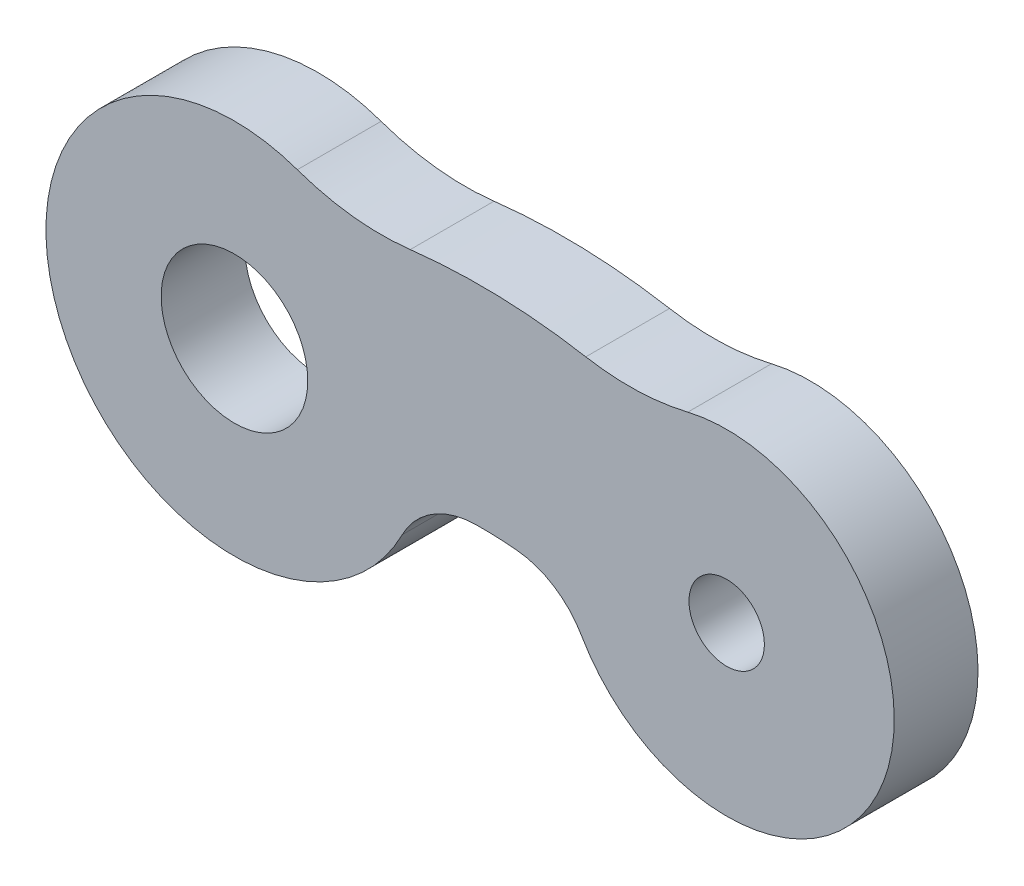
ISO-10303-21;
HEADER;
FILE_DESCRIPTION(('STEP AP214'),'2;1');
FILE_NAME('part.step','',(''),(''),'','','');
FILE_SCHEMA(('AUTOMOTIVE_DESIGN { 1 0 10303 214 1 1 1 1 }'));
ENDSEC;
DATA;
#1=APPLICATION_CONTEXT('core data for automotive mechanical design processes');
#2=APPLICATION_PROTOCOL_DEFINITION('international standard','automotive_design',2000,#1);
#3=PRODUCT_CONTEXT('',#1,'mechanical');
#4=PRODUCT('Part','Part','',(#3));
#5=PRODUCT_RELATED_PRODUCT_CATEGORY('part','',(#4));
#6=PRODUCT_DEFINITION_FORMATION('','',#4);
#7=PRODUCT_DEFINITION_CONTEXT('part definition',#1,'design');
#8=PRODUCT_DEFINITION('design','',#6,#7);
#9=PRODUCT_DEFINITION_SHAPE('','',#8);
#10=(LENGTH_UNIT() NAMED_UNIT(*) SI_UNIT(.MILLI.,.METRE.));
#11=(NAMED_UNIT(*) PLANE_ANGLE_UNIT() SI_UNIT($,.RADIAN.));
#12=(NAMED_UNIT(*) SI_UNIT($,.STERADIAN.) SOLID_ANGLE_UNIT());
#13=UNCERTAINTY_MEASURE_WITH_UNIT(LENGTH_MEASURE(1.E-05),#10,'distance_accuracy_value','');
#14=(GEOMETRIC_REPRESENTATION_CONTEXT(3) GLOBAL_UNCERTAINTY_ASSIGNED_CONTEXT((#13)) GLOBAL_UNIT_ASSIGNED_CONTEXT((#10,
#11,#12)) REPRESENTATION_CONTEXT('',''));
#15=CARTESIAN_POINT('',(0.,0.,0.));
#16=DIRECTION('',(0.,0.,1.));
#17=DIRECTION('',(1.,0.,0.));
#18=AXIS2_PLACEMENT_3D('',#15,#16,#17);
#19=CARTESIAN_POINT('',(10.5885127332144,4.86322396452138,2.));
#20=DIRECTION('',(0.,0.,1.));
#21=DIRECTION('',(1.,0.,0.));
#22=AXIS2_PLACEMENT_3D('',#19,#20,#21);
#23=PLANE('',#22);
#24=CARTESIAN_POINT('',(0.,0.,2.));
#25=DIRECTION('',(0.,0.,1.));
#26=DIRECTION('',(1.,0.,0.));
#27=AXIS2_PLACEMENT_3D('',#24,#25,#26);
#28=CIRCLE('',#27,1.75);
#29=CARTESIAN_POINT('',(1.75,0.,2.));
#30=VERTEX_POINT('',#29);
#31=EDGE_CURVE('E135',#30,#30,#28,.T.);
#32=ORIENTED_EDGE('',*,*,#31,.F.);
#33=EDGE_LOOP('',(#32));
#34=FACE_BOUND('',#33,.T.);
#35=CARTESIAN_POINT('',(9.42702546642888,9.72644792904275,2.));
#36=DIRECTION('',(0.,0.,-1.));
#37=DIRECTION('',(1.,0.,0.));
#38=AXIS2_PLACEMENT_3D('',#35,#36,#37);
#39=CIRCLE('',#38,6.);
#40=CARTESIAN_POINT('',(10.8208101865716,3.8905791716171,2.));
#41=VERTEX_POINT('',#40);
#42=CARTESIAN_POINT('',(8.38740825674238,3.81720127169939,2.));
#43=VERTEX_POINT('',#42);
#44=EDGE_CURVE('E146',#41,#43,#39,.T.);
#45=ORIENTED_EDGE('',*,*,#44,.T.);
#46=CARTESIAN_POINT('',(5.875,-10.4634781502137,2.));
#47=DIRECTION('',(0.,0.,1.));
#48=DIRECTION('',(-1.,0.,0.));
#49=AXIS2_PLACEMENT_3D('',#46,#47,#48);
#50=CIRCLE('',#49,14.5);
#51=CARTESIAN_POINT('',(4.19664720756028,3.93906092816096,2.));
#52=VERTEX_POINT('',#51);
#53=EDGE_CURVE('E94',#43,#52,#50,.T.);
#54=ORIENTED_EDGE('',*,*,#53,.T.);
#55=CARTESIAN_POINT('',(3.50215639689558,9.89873227093669,2.));
#56=DIRECTION('',(0.,0.,-1.));
#57=DIRECTION('',(-1.,0.,0.));
#58=AXIS2_PLACEMENT_3D('',#55,#56,#57);
#59=CIRCLE('',#58,6.);
#60=CARTESIAN_POINT('',(1.50092417009811,4.24231383040144,2.));
#61=VERTEX_POINT('',#60);
#62=EDGE_CURVE('E161',#52,#61,#59,.T.);
#63=ORIENTED_EDGE('',*,*,#62,.T.);
#64=CARTESIAN_POINT('',(0.,0.,2.));
#65=DIRECTION('',(0.,0.,1.));
#66=DIRECTION('',(1.,0.,0.));
#67=AXIS2_PLACEMENT_3D('',#64,#65,#66);
#68=CIRCLE('',#67,4.5);
#69=CARTESIAN_POINT('',(4.0049019391463,-2.05201375673317,2.));
#70=VERTEX_POINT('',#69);
#71=EDGE_CURVE('E174',#61,#70,#68,.T.);
#72=ORIENTED_EDGE('',*,*,#71,.T.);
#73=CARTESIAN_POINT('',(5.78485835654466,-2.9640198708368,2.));
#74=DIRECTION('',(0.,0.,-1.));
#75=DIRECTION('',(1.,0.,0.));
#76=AXIS2_PLACEMENT_3D('',#73,#74,#75);
#77=CIRCLE('',#76,2.);
#78=CARTESIAN_POINT('',(5.76082058495658,-0.964164329669615,2.));
#79=VERTEX_POINT('',#78);
#80=EDGE_CURVE('E113',#70,#79,#77,.T.);
#81=ORIENTED_EDGE('',*,*,#80,.T.);
#82=CARTESIAN_POINT('',(5.875,-10.4634781502137,2.));
#83=DIRECTION('',(0.,0.,-1.));
#84=DIRECTION('',(-1.,0.,0.));
#85=AXIS2_PLACEMENT_3D('',#82,#83,#84);
#86=CIRCLE('',#85,9.49999999999999);
#87=CARTESIAN_POINT('',(6.73045310472273,-1.00207233576838,2.));
#88=VERTEX_POINT('',#87);
#89=EDGE_CURVE('E107',#79,#88,#86,.T.);
#90=ORIENTED_EDGE('',*,*,#89,.T.);
#91=CARTESIAN_POINT('',(6.55035771425478,-2.99394724407266,2.));
#92=DIRECTION('',(0.,0.,-1.));
#93=DIRECTION('',(-1.,0.,0.));
#94=AXIS2_PLACEMENT_3D('',#91,#92,#93);
#95=CIRCLE('',#94,2.);
#96=CARTESIAN_POINT('',(8.28357180950319,-1.99596482938177,2.));
#97=VERTEX_POINT('',#96);
#98=EDGE_CURVE('E111',#88,#97,#95,.T.);
#99=ORIENTED_EDGE('',*,*,#98,.T.);
#100=CARTESIAN_POINT('',(11.75,0.,2.));
#101=DIRECTION('',(0.,0.,1.));
#102=DIRECTION('',(1.,0.,0.));
#103=AXIS2_PLACEMENT_3D('',#100,#101,#102);
#104=CIRCLE('',#103,4.);
#105=EDGE_CURVE('E51',#97,#41,#104,.T.);
#106=ORIENTED_EDGE('',*,*,#105,.T.);
#107=EDGE_LOOP('',(#45,#54,#63,#72,#81,#90,#99,#106));
#108=FACE_BOUND('',#107,.T.);
#109=CARTESIAN_POINT('',(11.75,0.,2.));
#110=DIRECTION('',(0.,0.,1.));
#111=DIRECTION('',(1.,0.,0.));
#112=AXIS2_PLACEMENT_3D('',#109,#110,#111);
#113=CIRCLE('',#112,0.9);
#114=CARTESIAN_POINT('',(12.65,0.,2.));
#115=VERTEX_POINT('',#114);
#116=EDGE_CURVE('E183',#115,#115,#113,.T.);
#117=ORIENTED_EDGE('',*,*,#116,.F.);
#118=EDGE_LOOP('',(#117));
#119=FACE_BOUND('',#118,.T.);
#120=ADVANCED_FACE('F34',(#34,#108,#119),#23,.T.);
#121=CARTESIAN_POINT('',(10.5885127332144,4.86322396452138,0.));
#122=DIRECTION('',(0.,0.,1.));
#123=DIRECTION('',(1.,0.,0.));
#124=AXIS2_PLACEMENT_3D('',#121,#122,#123);
#125=PLANE('',#124);
#126=CARTESIAN_POINT('',(9.42702546642888,9.72644792904275,0.));
#127=DIRECTION('',(0.,0.,-1.));
#128=DIRECTION('',(1.,0.,0.));
#129=AXIS2_PLACEMENT_3D('',#126,#127,#128);
#130=CIRCLE('',#129,6.);
#131=CARTESIAN_POINT('',(10.8208101865716,3.8905791716171,0.));
#132=VERTEX_POINT('',#131);
#133=CARTESIAN_POINT('',(8.38740825674238,3.81720127169939,0.));
#134=VERTEX_POINT('',#133);
#135=EDGE_CURVE('E131',#132,#134,#130,.T.);
#136=ORIENTED_EDGE('',*,*,#135,.F.);
#137=CARTESIAN_POINT('',(11.75,0.,0.));
#138=DIRECTION('',(0.,0.,1.));
#139=DIRECTION('',(1.,0.,0.));
#140=AXIS2_PLACEMENT_3D('',#137,#138,#139);
#141=CIRCLE('',#140,4.);
#142=CARTESIAN_POINT('',(8.28357180950319,-1.99596482938177,0.));
#143=VERTEX_POINT('',#142);
#144=EDGE_CURVE('E86',#143,#132,#141,.T.);
#145=ORIENTED_EDGE('',*,*,#144,.F.);
#146=CARTESIAN_POINT('',(6.55035771425478,-2.99394724407266,0.));
#147=DIRECTION('',(0.,0.,-1.));
#148=DIRECTION('',(-1.,0.,0.));
#149=AXIS2_PLACEMENT_3D('',#146,#147,#148);
#150=CIRCLE('',#149,2.);
#151=CARTESIAN_POINT('',(6.73045310472273,-1.00207233576838,0.));
#152=VERTEX_POINT('',#151);
#153=EDGE_CURVE('E80',#152,#143,#150,.T.);
#154=ORIENTED_EDGE('',*,*,#153,.F.);
#155=CARTESIAN_POINT('',(5.875,-10.4634781502137,0.));
#156=DIRECTION('',(0.,0.,-1.));
#157=DIRECTION('',(-1.,0.,0.));
#158=AXIS2_PLACEMENT_3D('',#155,#156,#157);
#159=CIRCLE('',#158,9.49999999999999);
#160=CARTESIAN_POINT('',(5.76082058495658,-0.964164329669615,0.));
#161=VERTEX_POINT('',#160);
#162=EDGE_CURVE('E121',#161,#152,#159,.T.);
#163=ORIENTED_EDGE('',*,*,#162,.F.);
#164=CARTESIAN_POINT('',(5.78485835654466,-2.9640198708368,0.));
#165=DIRECTION('',(0.,0.,-1.));
#166=DIRECTION('',(1.,0.,0.));
#167=AXIS2_PLACEMENT_3D('',#164,#165,#166);
#168=CIRCLE('',#167,2.);
#169=CARTESIAN_POINT('',(4.0049019391463,-2.05201375673317,0.));
#170=VERTEX_POINT('',#169);
#171=EDGE_CURVE('E141',#170,#161,#168,.T.);
#172=ORIENTED_EDGE('',*,*,#171,.F.);
#173=CARTESIAN_POINT('',(0.,0.,0.));
#174=DIRECTION('',(0.,0.,1.));
#175=DIRECTION('',(1.,0.,0.));
#176=AXIS2_PLACEMENT_3D('',#173,#174,#175);
#177=CIRCLE('',#176,4.5);
#178=CARTESIAN_POINT('',(1.50092417009811,4.24231383040144,0.));
#179=VERTEX_POINT('',#178);
#180=EDGE_CURVE('E139',#179,#170,#177,.T.);
#181=ORIENTED_EDGE('',*,*,#180,.F.);
#182=CARTESIAN_POINT('',(3.50215639689558,9.89873227093669,0.));
#183=DIRECTION('',(0.,0.,-1.));
#184=DIRECTION('',(-1.,0.,0.));
#185=AXIS2_PLACEMENT_3D('',#182,#183,#184);
#186=CIRCLE('',#185,6.);
#187=CARTESIAN_POINT('',(4.19664720756028,3.93906092816096,0.));
#188=VERTEX_POINT('',#187);
#189=EDGE_CURVE('E137',#188,#179,#186,.T.);
#190=ORIENTED_EDGE('',*,*,#189,.F.);
#191=CARTESIAN_POINT('',(5.875,-10.4634781502137,0.));
#192=DIRECTION('',(0.,0.,1.));
#193=DIRECTION('',(-1.,0.,0.));
#194=AXIS2_PLACEMENT_3D('',#191,#192,#193);
#195=CIRCLE('',#194,14.5);
#196=EDGE_CURVE('E134',#134,#188,#195,.T.);
#197=ORIENTED_EDGE('',*,*,#196,.F.);
#198=EDGE_LOOP('',(#136,#145,#154,#163,#172,#181,#190,#197));
#199=FACE_BOUND('',#198,.T.);
#200=CARTESIAN_POINT('',(0.,0.,0.));
#201=DIRECTION('',(0.,0.,1.));
#202=DIRECTION('',(1.,0.,0.));
#203=AXIS2_PLACEMENT_3D('',#200,#201,#202);
#204=CIRCLE('',#203,1.75);
#205=CARTESIAN_POINT('',(1.75,0.,0.));
#206=VERTEX_POINT('',#205);
#207=EDGE_CURVE('E180',#206,#206,#204,.T.);
#208=ORIENTED_EDGE('',*,*,#207,.T.);
#209=EDGE_LOOP('',(#208));
#210=FACE_BOUND('',#209,.T.);
#211=CARTESIAN_POINT('',(11.75,0.,0.));
#212=DIRECTION('',(0.,0.,1.));
#213=DIRECTION('',(1.,0.,0.));
#214=AXIS2_PLACEMENT_3D('',#211,#212,#213);
#215=CIRCLE('',#214,0.9);
#216=CARTESIAN_POINT('',(12.65,0.,0.));
#217=VERTEX_POINT('',#216);
#218=EDGE_CURVE('E186',#217,#217,#215,.T.);
#219=ORIENTED_EDGE('',*,*,#218,.T.);
#220=EDGE_LOOP('',(#219));
#221=FACE_BOUND('',#220,.T.);
#222=ADVANCED_FACE('F165',(#199,#210,#221),#125,.F.);
#223=CARTESIAN_POINT('',(9.42702546642888,9.72644792904275,2.));
#224=DIRECTION('',(0.,0.,-1.));
#225=DIRECTION('',(-1.,0.,0.));
#226=AXIS2_PLACEMENT_3D('',#223,#224,#225);
#227=CYLINDRICAL_SURFACE('',#226,6.);
#228=ORIENTED_EDGE('',*,*,#135,.T.);
#229=DIRECTION('',(0.,0.,-1.));
#230=VECTOR('',#229,1.);
#231=CARTESIAN_POINT('',(8.38740825674238,3.81720127169939,2.));
#232=LINE('',#231,#230);
#233=EDGE_CURVE('E11',#43,#134,#232,.T.);
#234=ORIENTED_EDGE('',*,*,#233,.F.);
#235=ORIENTED_EDGE('',*,*,#44,.F.);
#236=DIRECTION('',(0.,0.,-1.));
#237=VECTOR('',#236,1.);
#238=CARTESIAN_POINT('',(10.8208101865716,3.8905791716171,2.));
#239=LINE('',#238,#237);
#240=EDGE_CURVE('E127',#41,#132,#239,.T.);
#241=ORIENTED_EDGE('',*,*,#240,.T.);
#242=EDGE_LOOP('',(#228,#234,#235,#241));
#243=FACE_BOUND('',#242,.T.);
#244=ADVANCED_FACE('F36',(#243),#227,.F.);
#245=CARTESIAN_POINT('',(5.875,-10.4634781502137,2.));
#246=DIRECTION('',(0.,0.,-1.));
#247=DIRECTION('',(-1.,0.,0.));
#248=AXIS2_PLACEMENT_3D('',#245,#246,#247);
#249=CYLINDRICAL_SURFACE('',#248,14.5);
#250=ORIENTED_EDGE('',*,*,#196,.T.);
#251=DIRECTION('',(0.,0.,-1.));
#252=VECTOR('',#251,1.);
#253=CARTESIAN_POINT('',(4.19664720756028,3.93906092816096,2.));
#254=LINE('',#253,#252);
#255=EDGE_CURVE('E43',#52,#188,#254,.T.);
#256=ORIENTED_EDGE('',*,*,#255,.F.);
#257=ORIENTED_EDGE('',*,*,#53,.F.);
#258=ORIENTED_EDGE('',*,*,#233,.T.);
#259=EDGE_LOOP('',(#250,#256,#257,#258));
#260=FACE_BOUND('',#259,.T.);
#261=ADVANCED_FACE('F218',(#260),#249,.T.);
#262=CARTESIAN_POINT('',(3.50215639689558,9.89873227093669,2.));
#263=DIRECTION('',(0.,0.,-1.));
#264=DIRECTION('',(-1.,0.,0.));
#265=AXIS2_PLACEMENT_3D('',#262,#263,#264);
#266=CYLINDRICAL_SURFACE('',#265,6.);
#267=ORIENTED_EDGE('',*,*,#189,.T.);
#268=DIRECTION('',(0.,0.,-1.));
#269=VECTOR('',#268,1.);
#270=CARTESIAN_POINT('',(1.50092417009811,4.24231383040144,2.));
#271=LINE('',#270,#269);
#272=EDGE_CURVE('E153',#61,#179,#271,.T.);
#273=ORIENTED_EDGE('',*,*,#272,.F.);
#274=ORIENTED_EDGE('',*,*,#62,.F.);
#275=ORIENTED_EDGE('',*,*,#255,.T.);
#276=EDGE_LOOP('',(#267,#273,#274,#275));
#277=FACE_BOUND('',#276,.T.);
#278=ADVANCED_FACE('F159',(#277),#266,.F.);
#279=CARTESIAN_POINT('',(0.,0.,2.));
#280=DIRECTION('',(0.,0.,-1.));
#281=DIRECTION('',(-1.,0.,0.));
#282=AXIS2_PLACEMENT_3D('',#279,#280,#281);
#283=CYLINDRICAL_SURFACE('',#282,4.5);
#284=ORIENTED_EDGE('',*,*,#180,.T.);
#285=DIRECTION('',(0.,0.,-1.));
#286=VECTOR('',#285,1.);
#287=CARTESIAN_POINT('',(4.0049019391463,-2.05201375673317,2.));
#288=LINE('',#287,#286);
#289=EDGE_CURVE('E150',#70,#170,#288,.T.);
#290=ORIENTED_EDGE('',*,*,#289,.F.);
#291=ORIENTED_EDGE('',*,*,#71,.F.);
#292=ORIENTED_EDGE('',*,*,#272,.T.);
#293=EDGE_LOOP('',(#284,#290,#291,#292));
#294=FACE_BOUND('',#293,.T.);
#295=ADVANCED_FACE('F170',(#294),#283,.T.);
#296=CARTESIAN_POINT('',(5.78485835654466,-2.9640198708368,2.));
#297=DIRECTION('',(0.,0.,-1.));
#298=DIRECTION('',(-1.,0.,0.));
#299=AXIS2_PLACEMENT_3D('',#296,#297,#298);
#300=CYLINDRICAL_SURFACE('',#299,2.);
#301=ORIENTED_EDGE('',*,*,#171,.T.);
#302=DIRECTION('',(0.,0.,-1.));
#303=VECTOR('',#302,1.);
#304=CARTESIAN_POINT('',(5.76082058495658,-0.964164329669615,2.));
#305=LINE('',#304,#303);
#306=EDGE_CURVE('E122',#79,#161,#305,.T.);
#307=ORIENTED_EDGE('',*,*,#306,.F.);
#308=ORIENTED_EDGE('',*,*,#80,.F.);
#309=ORIENTED_EDGE('',*,*,#289,.T.);
#310=EDGE_LOOP('',(#301,#307,#308,#309));
#311=FACE_BOUND('',#310,.T.);
#312=ADVANCED_FACE('F173',(#311),#300,.F.);
#313=CARTESIAN_POINT('',(5.875,-10.4634781502137,2.));
#314=DIRECTION('',(0.,0.,-1.));
#315=DIRECTION('',(-1.,0.,0.));
#316=AXIS2_PLACEMENT_3D('',#313,#314,#315);
#317=CYLINDRICAL_SURFACE('',#316,9.49999999999999);
#318=ORIENTED_EDGE('',*,*,#162,.T.);
#319=DIRECTION('',(0.,0.,-1.));
#320=VECTOR('',#319,1.);
#321=CARTESIAN_POINT('',(6.73045310472273,-1.00207233576838,2.));
#322=LINE('',#321,#320);
#323=EDGE_CURVE('E118',#88,#152,#322,.T.);
#324=ORIENTED_EDGE('',*,*,#323,.F.);
#325=ORIENTED_EDGE('',*,*,#89,.F.);
#326=ORIENTED_EDGE('',*,*,#306,.T.);
#327=EDGE_LOOP('',(#318,#324,#325,#326));
#328=FACE_BOUND('',#327,.T.);
#329=ADVANCED_FACE('F119',(#328),#317,.F.);
#330=CARTESIAN_POINT('',(6.55035771425478,-2.99394724407266,2.));
#331=DIRECTION('',(0.,0.,-1.));
#332=DIRECTION('',(-1.,0.,0.));
#333=AXIS2_PLACEMENT_3D('',#330,#331,#332);
#334=CYLINDRICAL_SURFACE('',#333,2.);
#335=ORIENTED_EDGE('',*,*,#153,.T.);
#336=DIRECTION('',(0.,0.,-1.));
#337=VECTOR('',#336,1.);
#338=CARTESIAN_POINT('',(8.28357180950319,-1.99596482938177,2.));
#339=LINE('',#338,#337);
#340=EDGE_CURVE('E123',#97,#143,#339,.T.);
#341=ORIENTED_EDGE('',*,*,#340,.F.);
#342=ORIENTED_EDGE('',*,*,#98,.F.);
#343=ORIENTED_EDGE('',*,*,#323,.T.);
#344=EDGE_LOOP('',(#335,#341,#342,#343));
#345=FACE_BOUND('',#344,.T.);
#346=ADVANCED_FACE('F125',(#345),#334,.F.);
#347=CARTESIAN_POINT('',(11.75,0.,2.));
#348=DIRECTION('',(0.,0.,-1.));
#349=DIRECTION('',(-1.,0.,0.));
#350=AXIS2_PLACEMENT_3D('',#347,#348,#349);
#351=CYLINDRICAL_SURFACE('',#350,4.);
#352=ORIENTED_EDGE('',*,*,#144,.T.);
#353=ORIENTED_EDGE('',*,*,#240,.F.);
#354=ORIENTED_EDGE('',*,*,#105,.F.);
#355=ORIENTED_EDGE('',*,*,#340,.T.);
#356=EDGE_LOOP('',(#352,#353,#354,#355));
#357=FACE_BOUND('',#356,.T.);
#358=ADVANCED_FACE('F206',(#357),#351,.T.);
#359=CARTESIAN_POINT('',(0.,0.,2.));
#360=DIRECTION('',(0.,0.,-1.));
#361=DIRECTION('',(-1.,0.,0.));
#362=AXIS2_PLACEMENT_3D('',#359,#360,#361);
#363=CYLINDRICAL_SURFACE('',#362,1.75);
#364=ORIENTED_EDGE('',*,*,#31,.T.);
#365=EDGE_LOOP('',(#364));
#366=FACE_BOUND('',#365,.T.);
#367=ORIENTED_EDGE('',*,*,#207,.F.);
#368=EDGE_LOOP('',(#367));
#369=FACE_BOUND('',#368,.T.);
#370=ADVANCED_FACE('F203',(#366,#369),#363,.F.);
#371=CARTESIAN_POINT('',(11.75,0.,2.));
#372=DIRECTION('',(0.,0.,-1.));
#373=DIRECTION('',(-1.,0.,0.));
#374=AXIS2_PLACEMENT_3D('',#371,#372,#373);
#375=CYLINDRICAL_SURFACE('',#374,0.9);
#376=ORIENTED_EDGE('',*,*,#116,.T.);
#377=EDGE_LOOP('',(#376));
#378=FACE_BOUND('',#377,.T.);
#379=ORIENTED_EDGE('',*,*,#218,.F.);
#380=EDGE_LOOP('',(#379));
#381=FACE_BOUND('',#380,.T.);
#382=ADVANCED_FACE('F192',(#378,#381),#375,.F.);
#383=CLOSED_SHELL('',(#120,#222,#244,#261,#278,#295,#312,#329,#346,#358,#370,#382));
#384=MANIFOLD_SOLID_BREP('B2',#383);
#385=ADVANCED_BREP_SHAPE_REPRESENTATION('',(#18,#384),#14);
#386=SHAPE_DEFINITION_REPRESENTATION(#9,#385);
ENDSEC;
END-ISO-10303-21;
